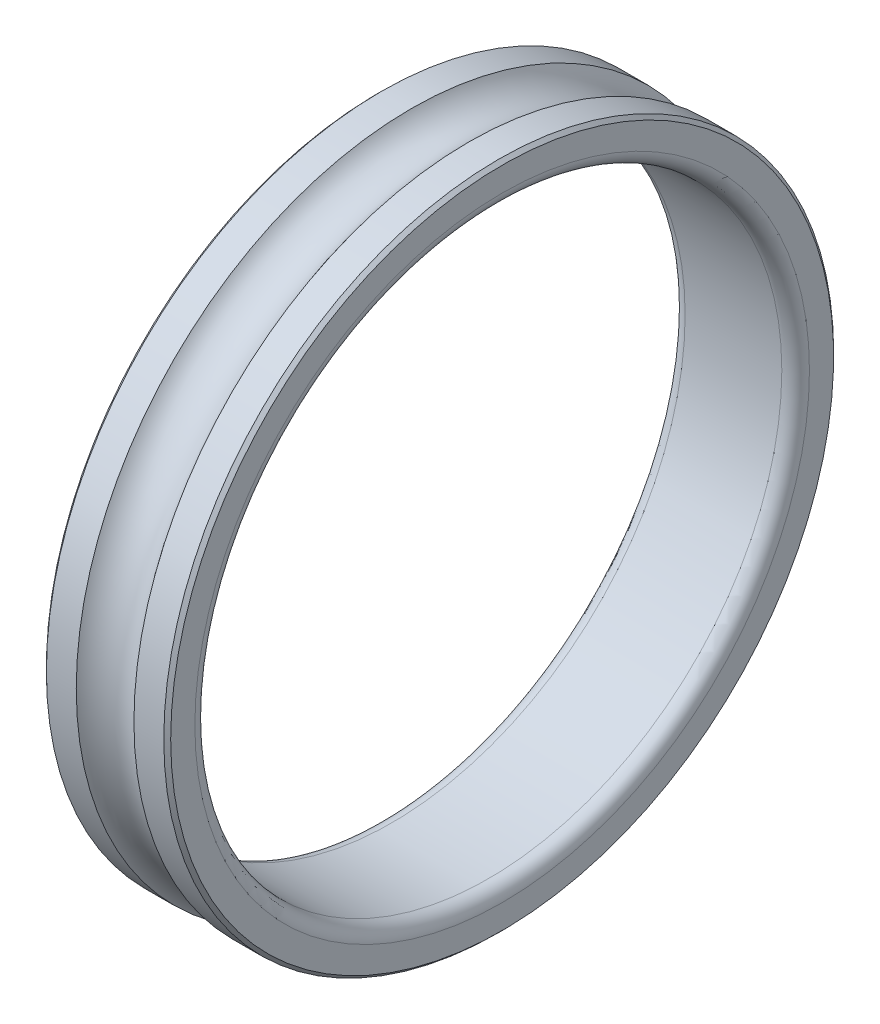
ISO-10303-21;
HEADER;
FILE_DESCRIPTION(('STEP AP214'),'2;1');
FILE_NAME('part.step','',(''),(''),'','','');
FILE_SCHEMA(('AUTOMOTIVE_DESIGN { 1 0 10303 214 1 1 1 1 }'));
ENDSEC;
DATA;
#1=APPLICATION_CONTEXT('core data for automotive mechanical design processes');
#2=APPLICATION_PROTOCOL_DEFINITION('international standard','automotive_design',2000,#1);
#3=PRODUCT_CONTEXT('',#1,'mechanical');
#4=PRODUCT('Part','Part','',(#3));
#5=PRODUCT_RELATED_PRODUCT_CATEGORY('part','',(#4));
#6=PRODUCT_DEFINITION_FORMATION('','',#4);
#7=PRODUCT_DEFINITION_CONTEXT('part definition',#1,'design');
#8=PRODUCT_DEFINITION('design','',#6,#7);
#9=PRODUCT_DEFINITION_SHAPE('','',#8);
#10=(LENGTH_UNIT() NAMED_UNIT(*) SI_UNIT(.MILLI.,.METRE.));
#11=(NAMED_UNIT(*) PLANE_ANGLE_UNIT() SI_UNIT($,.RADIAN.));
#12=(NAMED_UNIT(*) SI_UNIT($,.STERADIAN.) SOLID_ANGLE_UNIT());
#13=UNCERTAINTY_MEASURE_WITH_UNIT(LENGTH_MEASURE(1.E-05),#10,'distance_accuracy_value','');
#14=(GEOMETRIC_REPRESENTATION_CONTEXT(3) GLOBAL_UNCERTAINTY_ASSIGNED_CONTEXT((#13)) GLOBAL_UNIT_ASSIGNED_CONTEXT((#10,
#11,#12)) REPRESENTATION_CONTEXT('',''));
#15=CARTESIAN_POINT('',(0.,0.,0.));
#16=DIRECTION('',(0.,0.,1.));
#17=DIRECTION('',(1.,0.,0.));
#18=AXIS2_PLACEMENT_3D('',#15,#16,#17);
#19=CARTESIAN_POINT('',(0.,0.,0.));
#20=DIRECTION('',(-1.,0.,0.));
#21=DIRECTION('',(0.,0.,1.));
#22=AXIS2_PLACEMENT_3D('',#19,#20,#21);
#23=CYLINDRICAL_SURFACE('',#22,48.5);
#24=CARTESIAN_POINT('',(0.500000000000004,0.,0.));
#25=DIRECTION('',(1.,0.,0.));
#26=DIRECTION('',(0.,0.,-1.));
#27=AXIS2_PLACEMENT_3D('',#24,#25,#26);
#28=CIRCLE('',#27,48.5);
#29=CARTESIAN_POINT('',(0.500000000000004,0.,-48.5));
#30=VERTEX_POINT('',#29);
#31=EDGE_CURVE('E41',#30,#30,#28,.T.);
#32=ORIENTED_EDGE('',*,*,#31,.T.);
#33=EDGE_LOOP('',(#32));
#34=FACE_BOUND('',#33,.T.);
#35=CARTESIAN_POINT('',(4.82417672787748,0.,0.));
#36=DIRECTION('',(-1.,0.,0.));
#37=DIRECTION('',(0.,0.,1.));
#38=AXIS2_PLACEMENT_3D('',#35,#36,#37);
#39=CIRCLE('',#38,48.5);
#40=CARTESIAN_POINT('',(4.82417672787748,0.,48.5));
#41=VERTEX_POINT('',#40);
#42=EDGE_CURVE('E65',#41,#41,#39,.T.);
#43=ORIENTED_EDGE('',*,*,#42,.T.);
#44=EDGE_LOOP('',(#43));
#45=FACE_BOUND('',#44,.T.);
#46=ADVANCED_FACE('F31',(#34,#45),#23,.T.);
#47=CARTESIAN_POINT('',(0.,44.5,0.));
#48=DIRECTION('',(1.,0.,0.));
#49=DIRECTION('',(0.,0.,-1.));
#50=AXIS2_PLACEMENT_3D('',#47,#48,#49);
#51=PLANE('',#50);
#52=CARTESIAN_POINT('',(0.,0.,0.));
#53=DIRECTION('',(1.,0.,0.));
#54=DIRECTION('',(0.,0.,-1.));
#55=AXIS2_PLACEMENT_3D('',#52,#53,#54);
#56=CIRCLE('',#55,48.);
#57=CARTESIAN_POINT('',(0.,0.,-48.));
#58=VERTEX_POINT('',#57);
#59=EDGE_CURVE('E45',#58,#58,#56,.F.);
#60=ORIENTED_EDGE('',*,*,#59,.T.);
#61=EDGE_LOOP('',(#60));
#62=FACE_BOUND('',#61,.T.);
#63=CARTESIAN_POINT('',(0.,0.,0.));
#64=DIRECTION('',(-1.,0.,0.));
#65=DIRECTION('',(0.,0.,1.));
#66=AXIS2_PLACEMENT_3D('',#63,#64,#65);
#67=CIRCLE('',#66,44.5);
#68=CARTESIAN_POINT('',(0.,0.,44.5));
#69=VERTEX_POINT('',#68);
#70=EDGE_CURVE('E50',#69,#69,#67,.T.);
#71=ORIENTED_EDGE('',*,*,#70,.F.);
#72=EDGE_LOOP('',(#71));
#73=FACE_BOUND('',#72,.T.);
#74=ADVANCED_FACE('F87',(#62,#73),#51,.F.);
#75=CARTESIAN_POINT('',(2.,0.,0.));
#76=DIRECTION('',(-1.,0.,0.));
#77=DIRECTION('',(0.,0.,1.));
#78=AXIS2_PLACEMENT_3D('',#75,#76,#77);
#79=TOROIDAL_SURFACE('',#78,44.5,2.);
#80=CARTESIAN_POINT('',(2.00000000000001,0.,0.));
#81=DIRECTION('',(-1.,0.,0.));
#82=DIRECTION('',(0.,0.,1.));
#83=AXIS2_PLACEMENT_3D('',#80,#81,#82);
#84=CIRCLE('',#83,42.5);
#85=CARTESIAN_POINT('',(2.00000000000001,0.,42.5));
#86=VERTEX_POINT('',#85);
#87=EDGE_CURVE('E53',#86,#86,#84,.T.);
#88=ORIENTED_EDGE('',*,*,#87,.F.);
#89=EDGE_LOOP('',(#88));
#90=FACE_BOUND('',#89,.T.);
#91=ORIENTED_EDGE('',*,*,#70,.T.);
#92=EDGE_LOOP('',(#91));
#93=FACE_BOUND('',#92,.T.);
#94=ADVANCED_FACE('F92',(#90,#93),#79,.T.);
#95=CARTESIAN_POINT('',(0.,0.,0.));
#96=DIRECTION('',(-1.,0.,0.));
#97=DIRECTION('',(0.,0.,1.));
#98=AXIS2_PLACEMENT_3D('',#95,#96,#97);
#99=CYLINDRICAL_SURFACE('',#98,42.5);
#100=CARTESIAN_POINT('',(16.,0.,0.));
#101=DIRECTION('',(-1.,0.,0.));
#102=DIRECTION('',(0.,0.,1.));
#103=AXIS2_PLACEMENT_3D('',#100,#101,#102);
#104=CIRCLE('',#103,42.5);
#105=CARTESIAN_POINT('',(16.,0.,42.5));
#106=VERTEX_POINT('',#105);
#107=EDGE_CURVE('E56',#106,#106,#104,.T.);
#108=ORIENTED_EDGE('',*,*,#107,.F.);
#109=EDGE_LOOP('',(#108));
#110=FACE_BOUND('',#109,.T.);
#111=ORIENTED_EDGE('',*,*,#87,.T.);
#112=EDGE_LOOP('',(#111));
#113=FACE_BOUND('',#112,.T.);
#114=ADVANCED_FACE('F105',(#110,#113),#99,.F.);
#115=CARTESIAN_POINT('',(16.,0.,0.));
#116=DIRECTION('',(-1.,0.,0.));
#117=DIRECTION('',(0.,0.,1.));
#118=AXIS2_PLACEMENT_3D('',#115,#116,#117);
#119=TOROIDAL_SURFACE('',#118,44.5,2.);
#120=CARTESIAN_POINT('',(18.,0.,0.));
#121=DIRECTION('',(-1.,0.,0.));
#122=DIRECTION('',(0.,0.,1.));
#123=AXIS2_PLACEMENT_3D('',#120,#121,#122);
#124=CIRCLE('',#123,44.5);
#125=CARTESIAN_POINT('',(18.,0.,44.5));
#126=VERTEX_POINT('',#125);
#127=EDGE_CURVE('E59',#126,#126,#124,.T.);
#128=ORIENTED_EDGE('',*,*,#127,.F.);
#129=EDGE_LOOP('',(#128));
#130=FACE_BOUND('',#129,.T.);
#131=ORIENTED_EDGE('',*,*,#107,.T.);
#132=EDGE_LOOP('',(#131));
#133=FACE_BOUND('',#132,.T.);
#134=ADVANCED_FACE('F84',(#130,#133),#119,.T.);
#135=CARTESIAN_POINT('',(18.,48.5,0.));
#136=DIRECTION('',(-1.,0.,0.));
#137=DIRECTION('',(0.,0.,1.));
#138=AXIS2_PLACEMENT_3D('',#135,#136,#137);
#139=PLANE('',#138);
#140=CARTESIAN_POINT('',(18.,0.,0.));
#141=DIRECTION('',(-1.,0.,0.));
#142=DIRECTION('',(0.,0.,1.));
#143=AXIS2_PLACEMENT_3D('',#140,#141,#142);
#144=CIRCLE('',#143,48.);
#145=CARTESIAN_POINT('',(18.,0.,48.));
#146=VERTEX_POINT('',#145);
#147=EDGE_CURVE('E10',#146,#146,#144,.F.);
#148=ORIENTED_EDGE('',*,*,#147,.T.);
#149=EDGE_LOOP('',(#148));
#150=FACE_BOUND('',#149,.T.);
#151=ORIENTED_EDGE('',*,*,#127,.T.);
#152=EDGE_LOOP('',(#151));
#153=FACE_BOUND('',#152,.T.);
#154=ADVANCED_FACE('F79',(#150,#153),#139,.F.);
#155=CARTESIAN_POINT('',(0.,0.,0.));
#156=DIRECTION('',(-1.,0.,0.));
#157=DIRECTION('',(0.,0.,1.));
#158=AXIS2_PLACEMENT_3D('',#155,#156,#157);
#159=CYLINDRICAL_SURFACE('',#158,48.5);
#160=CARTESIAN_POINT('',(17.4999999999999,0.,0.));
#161=DIRECTION('',(-1.,0.,0.));
#162=DIRECTION('',(0.,0.,1.));
#163=AXIS2_PLACEMENT_3D('',#160,#161,#162);
#164=CIRCLE('',#163,48.5);
#165=CARTESIAN_POINT('',(17.4999999999999,0.,48.5));
#166=VERTEX_POINT('',#165);
#167=EDGE_CURVE('E37',#166,#166,#164,.T.);
#168=ORIENTED_EDGE('',*,*,#167,.T.);
#169=EDGE_LOOP('',(#168));
#170=FACE_BOUND('',#169,.T.);
#171=CARTESIAN_POINT('',(13.1758232721225,0.,0.));
#172=DIRECTION('',(-1.,0.,0.));
#173=DIRECTION('',(0.,0.,1.));
#174=AXIS2_PLACEMENT_3D('',#171,#172,#173);
#175=CIRCLE('',#174,48.5);
#176=CARTESIAN_POINT('',(13.1758232721225,0.,48.5));
#177=VERTEX_POINT('',#176);
#178=EDGE_CURVE('E62',#177,#177,#175,.T.);
#179=ORIENTED_EDGE('',*,*,#178,.F.);
#180=EDGE_LOOP('',(#179));
#181=FACE_BOUND('',#180,.T.);
#182=ADVANCED_FACE('F74',(#170,#181),#159,.T.);
#183=CARTESIAN_POINT('',(9.,0.,0.));
#184=DIRECTION('',(-1.,0.,0.));
#185=DIRECTION('',(0.,0.,1.));
#186=AXIS2_PLACEMENT_3D('',#183,#184,#185);
#187=TOROIDAL_SURFACE('',#186,51.25,5.);
#188=ORIENTED_EDGE('',*,*,#42,.F.);
#189=EDGE_LOOP('',(#188));
#190=FACE_BOUND('',#189,.T.);
#191=ORIENTED_EDGE('',*,*,#178,.T.);
#192=EDGE_LOOP('',(#191));
#193=FACE_BOUND('',#192,.T.);
#194=ADVANCED_FACE('F70',(#190,#193),#187,.F.);
#195=CARTESIAN_POINT('',(0.,0.,0.));
#196=DIRECTION('',(1.,0.,0.));
#197=DIRECTION('',(0.,0.,-1.));
#198=AXIS2_PLACEMENT_3D('',#195,#196,#197);
#199=CONICAL_SURFACE('',#198,48.,0.785398163397452);
#200=ORIENTED_EDGE('',*,*,#31,.F.);
#201=EDGE_LOOP('',(#200));
#202=FACE_BOUND('',#201,.T.);
#203=ORIENTED_EDGE('',*,*,#59,.F.);
#204=EDGE_LOOP('',(#203));
#205=FACE_BOUND('',#204,.T.);
#206=ADVANCED_FACE('F73',(#202,#205),#199,.T.);
#207=CARTESIAN_POINT('',(17.4999999999999,0.,0.));
#208=DIRECTION('',(-1.,0.,0.));
#209=DIRECTION('',(0.,0.,1.));
#210=AXIS2_PLACEMENT_3D('',#207,#208,#209);
#211=CONICAL_SURFACE('',#210,48.5,0.785398163397441);
#212=ORIENTED_EDGE('',*,*,#147,.F.);
#213=EDGE_LOOP('',(#212));
#214=FACE_BOUND('',#213,.T.);
#215=ORIENTED_EDGE('',*,*,#167,.F.);
#216=EDGE_LOOP('',(#215));
#217=FACE_BOUND('',#216,.T.);
#218=ADVANCED_FACE('F98',(#214,#217),#211,.T.);
#219=CLOSED_SHELL('',(#46,#74,#94,#114,#134,#154,#182,#194,#206,#218));
#220=MANIFOLD_SOLID_BREP('B2',#219);
#221=ADVANCED_BREP_SHAPE_REPRESENTATION('',(#18,#220),#14);
#222=SHAPE_DEFINITION_REPRESENTATION(#9,#221);
ENDSEC;
END-ISO-10303-21;
